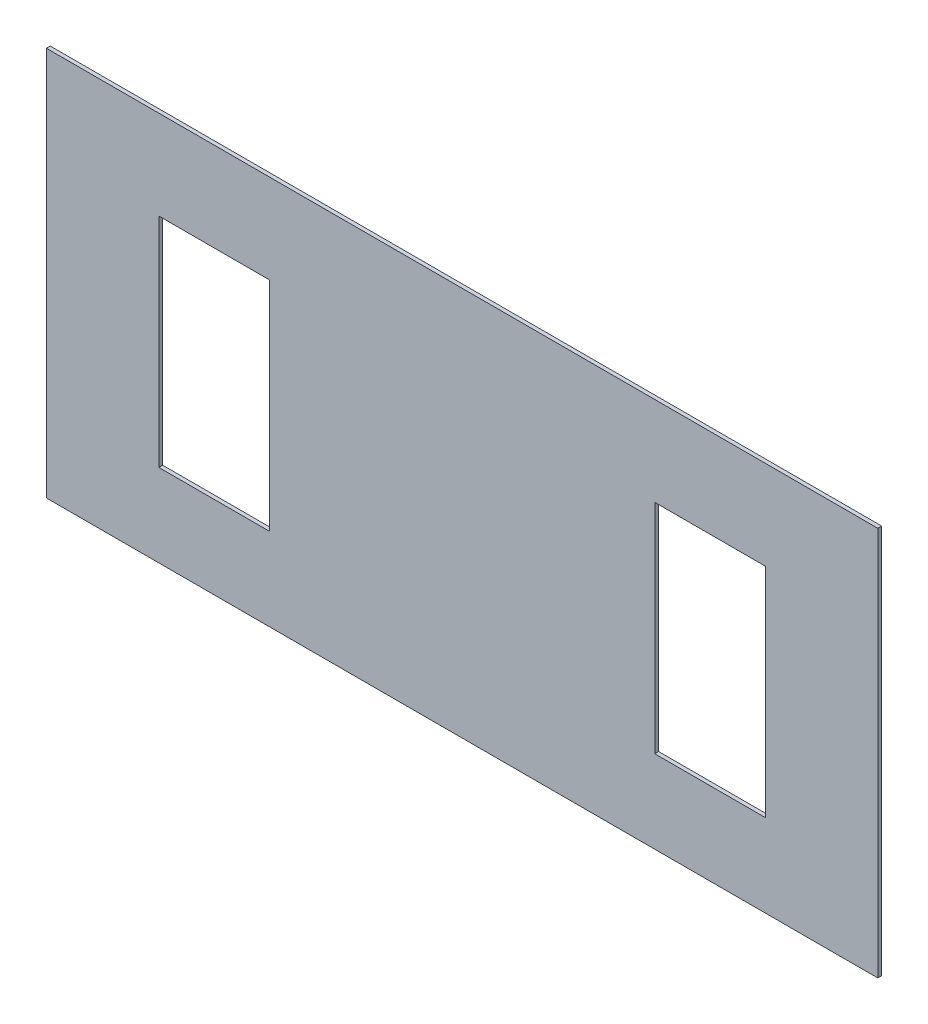
ISO-10303-21;
HEADER;
FILE_DESCRIPTION(('STEP AP214'),'2;1');
FILE_NAME('part.step','',(''),(''),'','','');
FILE_SCHEMA(('AUTOMOTIVE_DESIGN { 1 0 10303 214 1 1 1 1 }'));
ENDSEC;
DATA;
#1=APPLICATION_CONTEXT('core data for automotive mechanical design processes');
#2=APPLICATION_PROTOCOL_DEFINITION('international standard','automotive_design',2000,#1);
#3=PRODUCT_CONTEXT('',#1,'mechanical');
#4=PRODUCT('Part','Part','',(#3));
#5=PRODUCT_RELATED_PRODUCT_CATEGORY('part','',(#4));
#6=PRODUCT_DEFINITION_FORMATION('','',#4);
#7=PRODUCT_DEFINITION_CONTEXT('part definition',#1,'design');
#8=PRODUCT_DEFINITION('design','',#6,#7);
#9=PRODUCT_DEFINITION_SHAPE('','',#8);
#10=(LENGTH_UNIT() NAMED_UNIT(*) SI_UNIT(.MILLI.,.METRE.));
#11=(NAMED_UNIT(*) PLANE_ANGLE_UNIT() SI_UNIT($,.RADIAN.));
#12=(NAMED_UNIT(*) SI_UNIT($,.STERADIAN.) SOLID_ANGLE_UNIT());
#13=UNCERTAINTY_MEASURE_WITH_UNIT(LENGTH_MEASURE(1.E-05),#10,'distance_accuracy_value','');
#14=(GEOMETRIC_REPRESENTATION_CONTEXT(3) GLOBAL_UNCERTAINTY_ASSIGNED_CONTEXT((#13)) GLOBAL_UNIT_ASSIGNED_CONTEXT((#10,
#11,#12)) REPRESENTATION_CONTEXT('',''));
#15=CARTESIAN_POINT('',(0.,0.,0.));
#16=DIRECTION('',(0.,0.,1.));
#17=DIRECTION('',(1.,0.,0.));
#18=AXIS2_PLACEMENT_3D('',#15,#16,#17);
#19=CARTESIAN_POINT('',(422.475000000003,-100.000000000004,2.));
#20=DIRECTION('',(0.,1.,0.));
#21=DIRECTION('',(-1.,0.,0.));
#22=AXIS2_PLACEMENT_3D('',#19,#20,#21);
#23=PLANE('',#22);
#24=DIRECTION('',(1.,0.,0.));
#25=VECTOR('',#24,1.);
#26=CARTESIAN_POINT('',(422.475000000003,-100.000000000004,0.));
#27=LINE('',#26,#25);
#28=CARTESIAN_POINT('',(-11.5250000000008,-100.000000000002,0.));
#29=VERTEX_POINT('',#28);
#30=CARTESIAN_POINT('',(422.475000000003,-100.000000000004,0.));
#31=VERTEX_POINT('',#30);
#32=EDGE_CURVE('E157',#29,#31,#27,.T.);
#33=ORIENTED_EDGE('',*,*,#32,.T.);
#34=DIRECTION('',(0.,0.,-1.));
#35=VECTOR('',#34,1.);
#36=CARTESIAN_POINT('',(422.475000000003,-100.000000000004,2.));
#37=LINE('',#36,#35);
#38=CARTESIAN_POINT('',(422.475000000003,-100.000000000004,2.));
#39=VERTEX_POINT('',#38);
#40=EDGE_CURVE('E11',#39,#31,#37,.T.);
#41=ORIENTED_EDGE('',*,*,#40,.F.);
#42=DIRECTION('',(1.,0.,0.));
#43=VECTOR('',#42,1.);
#44=CARTESIAN_POINT('',(422.475000000003,-100.000000000004,2.));
#45=LINE('',#44,#43);
#46=CARTESIAN_POINT('',(-11.5250000000008,-100.000000000002,2.));
#47=VERTEX_POINT('',#46);
#48=EDGE_CURVE('E190',#47,#39,#45,.T.);
#49=ORIENTED_EDGE('',*,*,#48,.F.);
#50=DIRECTION('',(0.,0.,-1.));
#51=VECTOR('',#50,1.);
#52=CARTESIAN_POINT('',(-11.5250000000008,-100.000000000002,2.));
#53=LINE('',#52,#51);
#54=EDGE_CURVE('E200',#47,#29,#53,.T.);
#55=ORIENTED_EDGE('',*,*,#54,.T.);
#56=EDGE_LOOP('',(#33,#41,#49,#55));
#57=FACE_BOUND('',#56,.T.);
#58=ADVANCED_FACE('F32',(#57),#23,.F.);
#59=CARTESIAN_POINT('',(422.475000000002,103.336989563685,2.));
#60=DIRECTION('',(-1.,0.,0.));
#61=DIRECTION('',(0.,-1.,0.));
#62=AXIS2_PLACEMENT_3D('',#59,#60,#61);
#63=PLANE('',#62);
#64=DIRECTION('',(0.,1.,0.));
#65=VECTOR('',#64,1.);
#66=CARTESIAN_POINT('',(422.475000000002,103.336989563685,0.));
#67=LINE('',#66,#65);
#68=CARTESIAN_POINT('',(422.475000000002,103.336989563685,0.));
#69=VERTEX_POINT('',#68);
#70=EDGE_CURVE('E203',#31,#69,#67,.T.);
#71=ORIENTED_EDGE('',*,*,#70,.T.);
#72=DIRECTION('',(0.,0.,-1.));
#73=VECTOR('',#72,1.);
#74=CARTESIAN_POINT('',(422.475000000002,103.336989563685,2.));
#75=LINE('',#74,#73);
#76=CARTESIAN_POINT('',(422.475000000002,103.336989563685,2.));
#77=VERTEX_POINT('',#76);
#78=EDGE_CURVE('E39',#77,#69,#75,.T.);
#79=ORIENTED_EDGE('',*,*,#78,.F.);
#80=DIRECTION('',(0.,1.,0.));
#81=VECTOR('',#80,1.);
#82=CARTESIAN_POINT('',(422.475000000002,103.336989563685,2.));
#83=LINE('',#82,#81);
#84=EDGE_CURVE('E193',#39,#77,#83,.T.);
#85=ORIENTED_EDGE('',*,*,#84,.F.);
#86=ORIENTED_EDGE('',*,*,#40,.T.);
#87=EDGE_LOOP('',(#71,#79,#85,#86));
#88=FACE_BOUND('',#87,.T.);
#89=ADVANCED_FACE('F232',(#88),#63,.F.);
#90=CARTESIAN_POINT('',(-11.5249999999993,103.336989563686,2.));
#91=DIRECTION('',(0.,-1.,0.));
#92=DIRECTION('',(1.,0.,0.));
#93=AXIS2_PLACEMENT_3D('',#90,#91,#92);
#94=PLANE('',#93);
#95=DIRECTION('',(-1.,0.,0.));
#96=VECTOR('',#95,1.);
#97=CARTESIAN_POINT('',(-11.5249999999993,103.336989563686,0.));
#98=LINE('',#97,#96);
#99=CARTESIAN_POINT('',(-11.5249999999993,103.336989563686,0.));
#100=VERTEX_POINT('',#99);
#101=EDGE_CURVE('E205',#69,#100,#98,.T.);
#102=ORIENTED_EDGE('',*,*,#101,.T.);
#103=DIRECTION('',(0.,0.,-1.));
#104=VECTOR('',#103,1.);
#105=CARTESIAN_POINT('',(-11.5249999999993,103.336989563686,2.));
#106=LINE('',#105,#104);
#107=CARTESIAN_POINT('',(-11.5249999999993,103.336989563686,2.));
#108=VERTEX_POINT('',#107);
#109=EDGE_CURVE('E210',#108,#100,#106,.T.);
#110=ORIENTED_EDGE('',*,*,#109,.F.);
#111=DIRECTION('',(-1.,0.,0.));
#112=VECTOR('',#111,1.);
#113=CARTESIAN_POINT('',(-11.5249999999993,103.336989563686,2.));
#114=LINE('',#113,#112);
#115=EDGE_CURVE('E196',#77,#108,#114,.T.);
#116=ORIENTED_EDGE('',*,*,#115,.F.);
#117=ORIENTED_EDGE('',*,*,#78,.T.);
#118=EDGE_LOOP('',(#102,#110,#116,#117));
#119=FACE_BOUND('',#118,.T.);
#120=ADVANCED_FACE('F217',(#119),#94,.F.);
#121=CARTESIAN_POINT('',(-11.5250000000008,-100.000000000002,2.));
#122=DIRECTION('',(1.,0.,0.));
#123=DIRECTION('',(0.,1.,0.));
#124=AXIS2_PLACEMENT_3D('',#121,#122,#123);
#125=PLANE('',#124);
#126=DIRECTION('',(0.,-1.,0.));
#127=VECTOR('',#126,1.);
#128=CARTESIAN_POINT('',(-11.5250000000008,-100.000000000002,0.));
#129=LINE('',#128,#127);
#130=EDGE_CURVE('E194',#100,#29,#129,.T.);
#131=ORIENTED_EDGE('',*,*,#130,.T.);
#132=ORIENTED_EDGE('',*,*,#54,.F.);
#133=DIRECTION('',(0.,-1.,0.));
#134=VECTOR('',#133,1.);
#135=CARTESIAN_POINT('',(-11.5250000000008,-100.000000000002,2.));
#136=LINE('',#135,#134);
#137=EDGE_CURVE('E198',#108,#47,#136,.T.);
#138=ORIENTED_EDGE('',*,*,#137,.F.);
#139=ORIENTED_EDGE('',*,*,#109,.T.);
#140=EDGE_LOOP('',(#131,#132,#138,#139));
#141=FACE_BOUND('',#140,.T.);
#142=ADVANCED_FACE('F225',(#141),#125,.F.);
#143=CARTESIAN_POINT('',(0.,0.,2.));
#144=DIRECTION('',(0.,0.,-1.));
#145=DIRECTION('',(-1.,0.,0.));
#146=AXIS2_PLACEMENT_3D('',#143,#144,#145);
#147=PLANE('',#146);
#148=DIRECTION('',(1.,0.,0.));
#149=VECTOR('',#148,1.);
#150=CARTESIAN_POINT('',(104.886506596336,-56.8268176448967,2.));
#151=LINE('',#150,#149);
#152=CARTESIAN_POINT('',(47.1634934036614,-56.8268176448967,2.));
#153=VERTEX_POINT('',#152);
#154=CARTESIAN_POINT('',(104.886506596336,-56.8268176448967,2.));
#155=VERTEX_POINT('',#154);
#156=EDGE_CURVE('E150',#153,#155,#151,.T.);
#157=ORIENTED_EDGE('',*,*,#156,.F.);
#158=DIRECTION('',(0.,-1.,0.));
#159=VECTOR('',#158,1.);
#160=CARTESIAN_POINT('',(47.1634934036614,-56.8268176448967,2.));
#161=LINE('',#160,#159);
#162=CARTESIAN_POINT('',(47.1634934036614,56.8268176448967,2.));
#163=VERTEX_POINT('',#162);
#164=EDGE_CURVE('E46',#163,#153,#161,.T.);
#165=ORIENTED_EDGE('',*,*,#164,.F.);
#166=DIRECTION('',(-1.,0.,0.));
#167=VECTOR('',#166,1.);
#168=CARTESIAN_POINT('',(104.886506596336,56.8268176448967,2.));
#169=LINE('',#168,#167);
#170=CARTESIAN_POINT('',(104.886506596336,56.8268176448967,2.));
#171=VERTEX_POINT('',#170);
#172=EDGE_CURVE('E141',#171,#163,#169,.T.);
#173=ORIENTED_EDGE('',*,*,#172,.F.);
#174=DIRECTION('',(0.,1.,0.));
#175=VECTOR('',#174,1.);
#176=CARTESIAN_POINT('',(104.886506596336,-56.8268176448967,2.));
#177=LINE('',#176,#175);
#178=EDGE_CURVE('E144',#155,#171,#177,.T.);
#179=ORIENTED_EDGE('',*,*,#178,.F.);
#180=EDGE_LOOP('',(#157,#165,#173,#179));
#181=FACE_BOUND('',#180,.T.);
#182=DIRECTION('',(1.,0.,0.));
#183=VECTOR('',#182,1.);
#184=CARTESIAN_POINT('',(306.063493403666,-56.8268176448967,2.));
#185=LINE('',#184,#183);
#186=CARTESIAN_POINT('',(306.063493403666,-56.8268176448967,2.));
#187=VERTEX_POINT('',#186);
#188=CARTESIAN_POINT('',(363.786506596341,-56.8268176448967,2.));
#189=VERTEX_POINT('',#188);
#190=EDGE_CURVE('E176',#187,#189,#185,.T.);
#191=ORIENTED_EDGE('',*,*,#190,.F.);
#192=DIRECTION('',(0.,-1.,0.));
#193=VECTOR('',#192,1.);
#194=CARTESIAN_POINT('',(306.063493403666,-56.8268176448967,2.));
#195=LINE('',#194,#193);
#196=CARTESIAN_POINT('',(306.063493403666,56.8268176448967,2.));
#197=VERTEX_POINT('',#196);
#198=EDGE_CURVE('E54',#197,#187,#195,.T.);
#199=ORIENTED_EDGE('',*,*,#198,.F.);
#200=DIRECTION('',(-1.,0.,0.));
#201=VECTOR('',#200,1.);
#202=CARTESIAN_POINT('',(306.063493403666,56.8268176448967,2.));
#203=LINE('',#202,#201);
#204=CARTESIAN_POINT('',(363.786506596341,56.8268176448967,2.));
#205=VERTEX_POINT('',#204);
#206=EDGE_CURVE('E165',#205,#197,#203,.T.);
#207=ORIENTED_EDGE('',*,*,#206,.F.);
#208=DIRECTION('',(0.,1.,0.));
#209=VECTOR('',#208,1.);
#210=CARTESIAN_POINT('',(363.786506596341,-56.8268176448967,2.));
#211=LINE('',#210,#209);
#212=EDGE_CURVE('E179',#189,#205,#211,.T.);
#213=ORIENTED_EDGE('',*,*,#212,.F.);
#214=EDGE_LOOP('',(#191,#199,#207,#213));
#215=FACE_BOUND('',#214,.T.);
#216=ORIENTED_EDGE('',*,*,#48,.T.);
#217=ORIENTED_EDGE('',*,*,#84,.T.);
#218=ORIENTED_EDGE('',*,*,#115,.T.);
#219=ORIENTED_EDGE('',*,*,#137,.T.);
#220=EDGE_LOOP('',(#216,#217,#218,#219));
#221=FACE_BOUND('',#220,.T.);
#222=ADVANCED_FACE('F231',(#181,#215,#221),#147,.F.);
#223=CARTESIAN_POINT('',(0.,0.,0.));
#224=DIRECTION('',(0.,0.,-1.));
#225=DIRECTION('',(-1.,0.,0.));
#226=AXIS2_PLACEMENT_3D('',#223,#224,#225);
#227=PLANE('',#226);
#228=DIRECTION('',(0.,-1.,0.));
#229=VECTOR('',#228,1.);
#230=CARTESIAN_POINT('',(47.1634934036614,-56.8268176448967,0.));
#231=LINE('',#230,#229);
#232=CARTESIAN_POINT('',(47.1634934036614,56.8268176448967,0.));
#233=VERTEX_POINT('',#232);
#234=CARTESIAN_POINT('',(47.1634934036614,-56.8268176448967,0.));
#235=VERTEX_POINT('',#234);
#236=EDGE_CURVE('E122',#233,#235,#231,.T.);
#237=ORIENTED_EDGE('',*,*,#236,.T.);
#238=DIRECTION('',(1.,0.,0.));
#239=VECTOR('',#238,1.);
#240=CARTESIAN_POINT('',(104.886506596336,-56.8268176448967,0.));
#241=LINE('',#240,#239);
#242=CARTESIAN_POINT('',(104.886506596336,-56.8268176448967,0.));
#243=VERTEX_POINT('',#242);
#244=EDGE_CURVE('E132',#235,#243,#241,.T.);
#245=ORIENTED_EDGE('',*,*,#244,.T.);
#246=DIRECTION('',(0.,1.,0.));
#247=VECTOR('',#246,1.);
#248=CARTESIAN_POINT('',(104.886506596336,-56.8268176448967,0.));
#249=LINE('',#248,#247);
#250=CARTESIAN_POINT('',(104.886506596336,56.8268176448967,0.));
#251=VERTEX_POINT('',#250);
#252=EDGE_CURVE('E136',#243,#251,#249,.T.);
#253=ORIENTED_EDGE('',*,*,#252,.T.);
#254=DIRECTION('',(-1.,0.,0.));
#255=VECTOR('',#254,1.);
#256=CARTESIAN_POINT('',(104.886506596336,56.8268176448967,0.));
#257=LINE('',#256,#255);
#258=EDGE_CURVE('E128',#251,#233,#257,.T.);
#259=ORIENTED_EDGE('',*,*,#258,.T.);
#260=EDGE_LOOP('',(#237,#245,#253,#259));
#261=FACE_BOUND('',#260,.T.);
#262=DIRECTION('',(0.,-1.,0.));
#263=VECTOR('',#262,1.);
#264=CARTESIAN_POINT('',(306.063493403666,-56.8268176448967,0.));
#265=LINE('',#264,#263);
#266=CARTESIAN_POINT('',(306.063493403666,56.8268176448967,0.));
#267=VERTEX_POINT('',#266);
#268=CARTESIAN_POINT('',(306.063493403666,-56.8268176448967,0.));
#269=VERTEX_POINT('',#268);
#270=EDGE_CURVE('E161',#267,#269,#265,.T.);
#271=ORIENTED_EDGE('',*,*,#270,.T.);
#272=DIRECTION('',(1.,0.,0.));
#273=VECTOR('',#272,1.);
#274=CARTESIAN_POINT('',(306.063493403666,-56.8268176448967,0.));
#275=LINE('',#274,#273);
#276=CARTESIAN_POINT('',(363.786506596341,-56.8268176448967,0.));
#277=VERTEX_POINT('',#276);
#278=EDGE_CURVE('E164',#269,#277,#275,.T.);
#279=ORIENTED_EDGE('',*,*,#278,.T.);
#280=DIRECTION('',(0.,1.,0.));
#281=VECTOR('',#280,1.);
#282=CARTESIAN_POINT('',(363.786506596341,-56.8268176448967,0.));
#283=LINE('',#282,#281);
#284=CARTESIAN_POINT('',(363.786506596341,56.8268176448967,0.));
#285=VERTEX_POINT('',#284);
#286=EDGE_CURVE('E168',#277,#285,#283,.T.);
#287=ORIENTED_EDGE('',*,*,#286,.T.);
#288=DIRECTION('',(-1.,0.,0.));
#289=VECTOR('',#288,1.);
#290=CARTESIAN_POINT('',(306.063493403666,56.8268176448967,0.));
#291=LINE('',#290,#289);
#292=EDGE_CURVE('E171',#285,#267,#291,.T.);
#293=ORIENTED_EDGE('',*,*,#292,.T.);
#294=EDGE_LOOP('',(#271,#279,#287,#293));
#295=FACE_BOUND('',#294,.T.);
#296=ORIENTED_EDGE('',*,*,#32,.F.);
#297=ORIENTED_EDGE('',*,*,#130,.F.);
#298=ORIENTED_EDGE('',*,*,#101,.F.);
#299=ORIENTED_EDGE('',*,*,#70,.F.);
#300=EDGE_LOOP('',(#296,#297,#298,#299));
#301=FACE_BOUND('',#300,.T.);
#302=ADVANCED_FACE('F138',(#261,#295,#301),#227,.T.);
#303=CARTESIAN_POINT('',(306.063493403666,-56.8268176448967,0.));
#304=DIRECTION('',(-1.,0.,0.));
#305=DIRECTION('',(0.,0.,1.));
#306=AXIS2_PLACEMENT_3D('',#303,#304,#305);
#307=PLANE('',#306);
#308=ORIENTED_EDGE('',*,*,#198,.T.);
#309=DIRECTION('',(0.,0.,1.));
#310=VECTOR('',#309,1.);
#311=CARTESIAN_POINT('',(306.063493403666,-56.8268176448967,0.));
#312=LINE('',#311,#310);
#313=EDGE_CURVE('E174',#269,#187,#312,.T.);
#314=ORIENTED_EDGE('',*,*,#313,.F.);
#315=ORIENTED_EDGE('',*,*,#270,.F.);
#316=DIRECTION('',(0.,0.,1.));
#317=VECTOR('',#316,1.);
#318=CARTESIAN_POINT('',(306.063493403666,56.8268176448967,0.));
#319=LINE('',#318,#317);
#320=EDGE_CURVE('E151',#267,#197,#319,.T.);
#321=ORIENTED_EDGE('',*,*,#320,.T.);
#322=EDGE_LOOP('',(#308,#314,#315,#321));
#323=FACE_BOUND('',#322,.T.);
#324=ADVANCED_FACE('F244',(#323),#307,.F.);
#325=CARTESIAN_POINT('',(306.063493403666,56.8268176448967,0.));
#326=DIRECTION('',(0.,1.,0.));
#327=DIRECTION('',(0.,0.,1.));
#328=AXIS2_PLACEMENT_3D('',#325,#326,#327);
#329=PLANE('',#328);
#330=ORIENTED_EDGE('',*,*,#206,.T.);
#331=ORIENTED_EDGE('',*,*,#320,.F.);
#332=ORIENTED_EDGE('',*,*,#292,.F.);
#333=DIRECTION('',(0.,0.,1.));
#334=VECTOR('',#333,1.);
#335=CARTESIAN_POINT('',(363.786506596341,56.8268176448967,0.));
#336=LINE('',#335,#334);
#337=EDGE_CURVE('E185',#285,#205,#336,.T.);
#338=ORIENTED_EDGE('',*,*,#337,.T.);
#339=EDGE_LOOP('',(#330,#331,#332,#338));
#340=FACE_BOUND('',#339,.T.);
#341=ADVANCED_FACE('F250',(#340),#329,.F.);
#342=CARTESIAN_POINT('',(363.786506596341,-56.8268176448967,0.));
#343=DIRECTION('',(1.,0.,0.));
#344=DIRECTION('',(0.,0.,-1.));
#345=AXIS2_PLACEMENT_3D('',#342,#343,#344);
#346=PLANE('',#345);
#347=ORIENTED_EDGE('',*,*,#212,.T.);
#348=ORIENTED_EDGE('',*,*,#337,.F.);
#349=ORIENTED_EDGE('',*,*,#286,.F.);
#350=DIRECTION('',(0.,0.,1.));
#351=VECTOR('',#350,1.);
#352=CARTESIAN_POINT('',(363.786506596341,-56.8268176448967,0.));
#353=LINE('',#352,#351);
#354=EDGE_CURVE('E187',#277,#189,#353,.T.);
#355=ORIENTED_EDGE('',*,*,#354,.T.);
#356=EDGE_LOOP('',(#347,#348,#349,#355));
#357=FACE_BOUND('',#356,.T.);
#358=ADVANCED_FACE('F254',(#357),#346,.F.);
#359=CARTESIAN_POINT('',(306.063493403666,-56.8268176448967,0.));
#360=DIRECTION('',(0.,-1.,0.));
#361=DIRECTION('',(1.,0.,0.));
#362=AXIS2_PLACEMENT_3D('',#359,#360,#361);
#363=PLANE('',#362);
#364=ORIENTED_EDGE('',*,*,#190,.T.);
#365=ORIENTED_EDGE('',*,*,#354,.F.);
#366=ORIENTED_EDGE('',*,*,#278,.F.);
#367=ORIENTED_EDGE('',*,*,#313,.T.);
#368=EDGE_LOOP('',(#364,#365,#366,#367));
#369=FACE_BOUND('',#368,.T.);
#370=ADVANCED_FACE('F251',(#369),#363,.F.);
#371=CARTESIAN_POINT('',(47.1634934036614,-56.8268176448967,0.));
#372=DIRECTION('',(-1.,0.,0.));
#373=DIRECTION('',(0.,0.,1.));
#374=AXIS2_PLACEMENT_3D('',#371,#372,#373);
#375=PLANE('',#374);
#376=ORIENTED_EDGE('',*,*,#164,.T.);
#377=DIRECTION('',(0.,0.,1.));
#378=VECTOR('',#377,1.);
#379=CARTESIAN_POINT('',(47.1634934036614,-56.8268176448967,0.));
#380=LINE('',#379,#378);
#381=EDGE_CURVE('E118',#235,#153,#380,.T.);
#382=ORIENTED_EDGE('',*,*,#381,.F.);
#383=ORIENTED_EDGE('',*,*,#236,.F.);
#384=DIRECTION('',(0.,0.,1.));
#385=VECTOR('',#384,1.);
#386=CARTESIAN_POINT('',(47.1634934036614,56.8268176448967,0.));
#387=LINE('',#386,#385);
#388=EDGE_CURVE('E155',#233,#163,#387,.T.);
#389=ORIENTED_EDGE('',*,*,#388,.T.);
#390=EDGE_LOOP('',(#376,#382,#383,#389));
#391=FACE_BOUND('',#390,.T.);
#392=ADVANCED_FACE('F120',(#391),#375,.F.);
#393=CARTESIAN_POINT('',(104.886506596336,56.8268176448967,0.));
#394=DIRECTION('',(0.,1.,0.));
#395=DIRECTION('',(0.,0.,1.));
#396=AXIS2_PLACEMENT_3D('',#393,#394,#395);
#397=PLANE('',#396);
#398=ORIENTED_EDGE('',*,*,#172,.T.);
#399=ORIENTED_EDGE('',*,*,#388,.F.);
#400=ORIENTED_EDGE('',*,*,#258,.F.);
#401=DIRECTION('',(0.,0.,1.));
#402=VECTOR('',#401,1.);
#403=CARTESIAN_POINT('',(104.886506596336,56.8268176448967,0.));
#404=LINE('',#403,#402);
#405=EDGE_CURVE('E158',#251,#171,#404,.T.);
#406=ORIENTED_EDGE('',*,*,#405,.T.);
#407=EDGE_LOOP('',(#398,#399,#400,#406));
#408=FACE_BOUND('',#407,.T.);
#409=ADVANCED_FACE('F264',(#408),#397,.F.);
#410=CARTESIAN_POINT('',(104.886506596336,-56.8268176448967,0.));
#411=DIRECTION('',(1.,0.,0.));
#412=DIRECTION('',(0.,0.,-1.));
#413=AXIS2_PLACEMENT_3D('',#410,#411,#412);
#414=PLANE('',#413);
#415=ORIENTED_EDGE('',*,*,#178,.T.);
#416=ORIENTED_EDGE('',*,*,#405,.F.);
#417=ORIENTED_EDGE('',*,*,#252,.F.);
#418=DIRECTION('',(0.,0.,1.));
#419=VECTOR('',#418,1.);
#420=CARTESIAN_POINT('',(104.886506596336,-56.8268176448967,0.));
#421=LINE('',#420,#419);
#422=EDGE_CURVE('E127',#243,#155,#421,.T.);
#423=ORIENTED_EDGE('',*,*,#422,.T.);
#424=EDGE_LOOP('',(#415,#416,#417,#423));
#425=FACE_BOUND('',#424,.T.);
#426=ADVANCED_FACE('F267',(#425),#414,.F.);
#427=CARTESIAN_POINT('',(104.886506596336,-56.8268176448967,0.));
#428=DIRECTION('',(0.,-1.,0.));
#429=DIRECTION('',(1.,0.,0.));
#430=AXIS2_PLACEMENT_3D('',#427,#428,#429);
#431=PLANE('',#430);
#432=ORIENTED_EDGE('',*,*,#156,.T.);
#433=ORIENTED_EDGE('',*,*,#422,.F.);
#434=ORIENTED_EDGE('',*,*,#244,.F.);
#435=ORIENTED_EDGE('',*,*,#381,.T.);
#436=EDGE_LOOP('',(#432,#433,#434,#435));
#437=FACE_BOUND('',#436,.T.);
#438=ADVANCED_FACE('F133',(#437),#431,.F.);
#439=CLOSED_SHELL('',(#58,#89,#120,#142,#222,#302,#324,#341,#358,#370,#392,#409,#426,#438));
#440=MANIFOLD_SOLID_BREP('B2',#439);
#441=ADVANCED_BREP_SHAPE_REPRESENTATION('',(#18,#440),#14);
#442=SHAPE_DEFINITION_REPRESENTATION(#9,#441);
ENDSEC;
END-ISO-10303-21;
